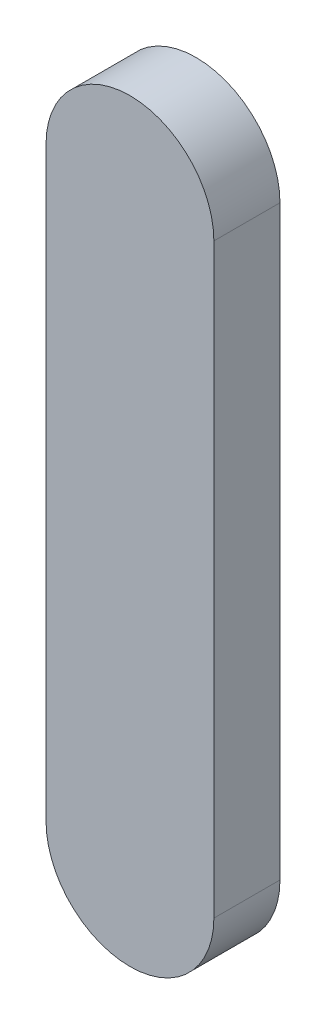
ISO-10303-21;
HEADER;
FILE_DESCRIPTION(('STEP AP214'),'2;1');
FILE_NAME('part.step','',(''),(''),'','','');
FILE_SCHEMA(('AUTOMOTIVE_DESIGN { 1 0 10303 214 1 1 1 1 }'));
ENDSEC;
DATA;
#1=APPLICATION_CONTEXT('core data for automotive mechanical design processes');
#2=APPLICATION_PROTOCOL_DEFINITION('international standard','automotive_design',2000,#1);
#3=PRODUCT_CONTEXT('',#1,'mechanical');
#4=PRODUCT('Part','Part','',(#3));
#5=PRODUCT_RELATED_PRODUCT_CATEGORY('part','',(#4));
#6=PRODUCT_DEFINITION_FORMATION('','',#4);
#7=PRODUCT_DEFINITION_CONTEXT('part definition',#1,'design');
#8=PRODUCT_DEFINITION('design','',#6,#7);
#9=PRODUCT_DEFINITION_SHAPE('','',#8);
#10=(LENGTH_UNIT() NAMED_UNIT(*) SI_UNIT(.MILLI.,.METRE.));
#11=(NAMED_UNIT(*) PLANE_ANGLE_UNIT() SI_UNIT($,.RADIAN.));
#12=(NAMED_UNIT(*) SI_UNIT($,.STERADIAN.) SOLID_ANGLE_UNIT());
#13=UNCERTAINTY_MEASURE_WITH_UNIT(LENGTH_MEASURE(1.E-05),#10,'distance_accuracy_value','');
#14=(GEOMETRIC_REPRESENTATION_CONTEXT(3) GLOBAL_UNCERTAINTY_ASSIGNED_CONTEXT((#13)) GLOBAL_UNIT_ASSIGNED_CONTEXT((#10,
#11,#12)) REPRESENTATION_CONTEXT('',''));
#15=CARTESIAN_POINT('',(0.,0.,0.));
#16=DIRECTION('',(0.,0.,1.));
#17=DIRECTION('',(1.,0.,0.));
#18=AXIS2_PLACEMENT_3D('',#15,#16,#17);
#19=CARTESIAN_POINT('',(150.5655104,80.1934896,0.));
#20=DIRECTION('',(-1.,0.,0.));
#21=DIRECTION('',(0.,1.,0.));
#22=AXIS2_PLACEMENT_3D('',#19,#20,#21);
#23=PLANE('',#22);
#24=DIRECTION('',(0.,1.,0.));
#25=VECTOR('',#24,1.);
#26=CARTESIAN_POINT('',(150.5655104,80.1934896,0.1999996));
#27=LINE('',#26,#25);
#28=CARTESIAN_POINT('',(150.5655104,80.1934896,0.1999996));
#29=VERTEX_POINT('',#28);
#30=CARTESIAN_POINT('',(150.5655104,81.9684924,0.1999996));
#31=VERTEX_POINT('',#30);
#32=EDGE_CURVE('E11',#29,#31,#27,.T.);
#33=ORIENTED_EDGE('',*,*,#32,.F.);
#34=DIRECTION('',(0.,0.,1.));
#35=VECTOR('',#34,1.);
#36=CARTESIAN_POINT('',(150.5655104,80.1934896,0.));
#37=LINE('',#36,#35);
#38=CARTESIAN_POINT('',(150.5655104,80.1934896,0.));
#39=VERTEX_POINT('',#38);
#40=EDGE_CURVE('E24',#39,#29,#37,.T.);
#41=ORIENTED_EDGE('',*,*,#40,.F.);
#42=DIRECTION('',(0.,1.,0.));
#43=VECTOR('',#42,1.);
#44=CARTESIAN_POINT('',(150.5655104,80.1934896,0.));
#45=LINE('',#44,#43);
#46=CARTESIAN_POINT('',(150.5655104,81.9684924,0.));
#47=VERTEX_POINT('',#46);
#48=EDGE_CURVE('E75',#39,#47,#45,.T.);
#49=ORIENTED_EDGE('',*,*,#48,.T.);
#50=DIRECTION('',(0.,0.,1.));
#51=VECTOR('',#50,1.);
#52=CARTESIAN_POINT('',(150.5655104,81.9684924,0.));
#53=LINE('',#52,#51);
#54=EDGE_CURVE('E37',#47,#31,#53,.T.);
#55=ORIENTED_EDGE('',*,*,#54,.T.);
#56=EDGE_LOOP('',(#33,#41,#49,#55));
#57=FACE_BOUND('',#56,.T.);
#58=ADVANCED_FACE('F17',(#57),#23,.F.);
#59=CARTESIAN_POINT('',(150.3115104,81.9684924,0.));
#60=DIRECTION('',(0.,0.,-1.));
#61=DIRECTION('',(1.,0.,0.));
#62=AXIS2_PLACEMENT_3D('',#59,#60,#61);
#63=CYLINDRICAL_SURFACE('',#62,0.253999999999986);
#64=CARTESIAN_POINT('',(150.3115104,81.9684924,0.1999996));
#65=DIRECTION('',(0.,0.,1.));
#66=DIRECTION('',(1.,0.,0.));
#67=AXIS2_PLACEMENT_3D('',#64,#65,#66);
#68=CIRCLE('',#67,0.253999999999986);
#69=CARTESIAN_POINT('',(150.0575104,81.9684924,0.1999996));
#70=VERTEX_POINT('',#69);
#71=EDGE_CURVE('E83',#31,#70,#68,.T.);
#72=ORIENTED_EDGE('',*,*,#71,.F.);
#73=ORIENTED_EDGE('',*,*,#54,.F.);
#74=CARTESIAN_POINT('',(150.3115104,81.9684924,0.));
#75=DIRECTION('',(0.,0.,1.));
#76=DIRECTION('',(1.,0.,0.));
#77=AXIS2_PLACEMENT_3D('',#74,#75,#76);
#78=CIRCLE('',#77,0.253999999999986);
#79=CARTESIAN_POINT('',(150.0575104,81.9684924,0.));
#80=VERTEX_POINT('',#79);
#81=EDGE_CURVE('E81',#47,#80,#78,.T.);
#82=ORIENTED_EDGE('',*,*,#81,.T.);
#83=DIRECTION('',(0.,0.,1.));
#84=VECTOR('',#83,1.);
#85=CARTESIAN_POINT('',(150.0575104,81.9684924,0.));
#86=LINE('',#85,#84);
#87=EDGE_CURVE('E67',#80,#70,#86,.T.);
#88=ORIENTED_EDGE('',*,*,#87,.T.);
#89=EDGE_LOOP('',(#72,#73,#82,#88));
#90=FACE_BOUND('',#89,.T.);
#91=ADVANCED_FACE('F89',(#90),#63,.T.);
#92=CARTESIAN_POINT('',(150.0575104,81.9684924,0.));
#93=DIRECTION('',(1.,0.,0.));
#94=DIRECTION('',(0.,-1.,0.));
#95=AXIS2_PLACEMENT_3D('',#92,#93,#94);
#96=PLANE('',#95);
#97=DIRECTION('',(0.,-1.,0.));
#98=VECTOR('',#97,1.);
#99=CARTESIAN_POINT('',(150.0575104,81.9684924,0.1999996));
#100=LINE('',#99,#98);
#101=CARTESIAN_POINT('',(150.0575104,80.1934896,0.1999996));
#102=VERTEX_POINT('',#101);
#103=EDGE_CURVE('E71',#70,#102,#100,.T.);
#104=ORIENTED_EDGE('',*,*,#103,.F.);
#105=ORIENTED_EDGE('',*,*,#87,.F.);
#106=DIRECTION('',(0.,-1.,0.));
#107=VECTOR('',#106,1.);
#108=CARTESIAN_POINT('',(150.0575104,81.9684924,0.));
#109=LINE('',#108,#107);
#110=CARTESIAN_POINT('',(150.0575104,80.1934896,0.));
#111=VERTEX_POINT('',#110);
#112=EDGE_CURVE('E63',#80,#111,#109,.T.);
#113=ORIENTED_EDGE('',*,*,#112,.T.);
#114=DIRECTION('',(0.,0.,1.));
#115=VECTOR('',#114,1.);
#116=CARTESIAN_POINT('',(150.0575104,80.1934896,0.));
#117=LINE('',#116,#115);
#118=EDGE_CURVE('E53',#111,#102,#117,.T.);
#119=ORIENTED_EDGE('',*,*,#118,.T.);
#120=EDGE_LOOP('',(#104,#105,#113,#119));
#121=FACE_BOUND('',#120,.T.);
#122=ADVANCED_FACE('F66',(#121),#96,.F.);
#123=CARTESIAN_POINT('',(150.3115104,80.1934896,0.));
#124=DIRECTION('',(0.,0.,-1.));
#125=DIRECTION('',(-1.,0.,0.));
#126=AXIS2_PLACEMENT_3D('',#123,#124,#125);
#127=CYLINDRICAL_SURFACE('',#126,0.253999999999986);
#128=CARTESIAN_POINT('',(150.3115104,80.1934896,0.1999996));
#129=DIRECTION('',(0.,0.,1.));
#130=DIRECTION('',(-1.,0.,0.));
#131=AXIS2_PLACEMENT_3D('',#128,#129,#130);
#132=CIRCLE('',#131,0.253999999999986);
#133=EDGE_CURVE('E59',#102,#29,#132,.T.);
#134=ORIENTED_EDGE('',*,*,#133,.F.);
#135=ORIENTED_EDGE('',*,*,#118,.F.);
#136=CARTESIAN_POINT('',(150.3115104,80.1934896,0.));
#137=DIRECTION('',(0.,0.,1.));
#138=DIRECTION('',(-1.,0.,0.));
#139=AXIS2_PLACEMENT_3D('',#136,#137,#138);
#140=CIRCLE('',#139,0.253999999999986);
#141=EDGE_CURVE('E57',#111,#39,#140,.T.);
#142=ORIENTED_EDGE('',*,*,#141,.T.);
#143=ORIENTED_EDGE('',*,*,#40,.T.);
#144=EDGE_LOOP('',(#134,#135,#142,#143));
#145=FACE_BOUND('',#144,.T.);
#146=ADVANCED_FACE('F55',(#145),#127,.T.);
#147=CARTESIAN_POINT('',(150.5655104,80.1934896,0.));
#148=DIRECTION('',(0.,0.,-1.));
#149=DIRECTION('',(-1.,0.,0.));
#150=AXIS2_PLACEMENT_3D('',#147,#148,#149);
#151=PLANE('',#150);
#152=ORIENTED_EDGE('',*,*,#141,.F.);
#153=ORIENTED_EDGE('',*,*,#112,.F.);
#154=ORIENTED_EDGE('',*,*,#81,.F.);
#155=ORIENTED_EDGE('',*,*,#48,.F.);
#156=EDGE_LOOP('',(#152,#153,#154,#155));
#157=FACE_BOUND('',#156,.T.);
#158=ADVANCED_FACE('F74',(#157),#151,.T.);
#159=CARTESIAN_POINT('',(150.5655104,80.1934896,0.1999996));
#160=DIRECTION('',(0.,0.,-1.));
#161=DIRECTION('',(-1.,0.,0.));
#162=AXIS2_PLACEMENT_3D('',#159,#160,#161);
#163=PLANE('',#162);
#164=ORIENTED_EDGE('',*,*,#32,.T.);
#165=ORIENTED_EDGE('',*,*,#71,.T.);
#166=ORIENTED_EDGE('',*,*,#103,.T.);
#167=ORIENTED_EDGE('',*,*,#133,.T.);
#168=EDGE_LOOP('',(#164,#165,#166,#167));
#169=FACE_BOUND('',#168,.T.);
#170=ADVANCED_FACE('F91',(#169),#163,.F.);
#171=CLOSED_SHELL('',(#58,#91,#122,#146,#158,#170));
#172=MANIFOLD_SOLID_BREP('B1',#171);
#173=ADVANCED_BREP_SHAPE_REPRESENTATION('',(#18,#172),#14);
#174=SHAPE_DEFINITION_REPRESENTATION(#9,#173);
ENDSEC;
END-ISO-10303-21;
